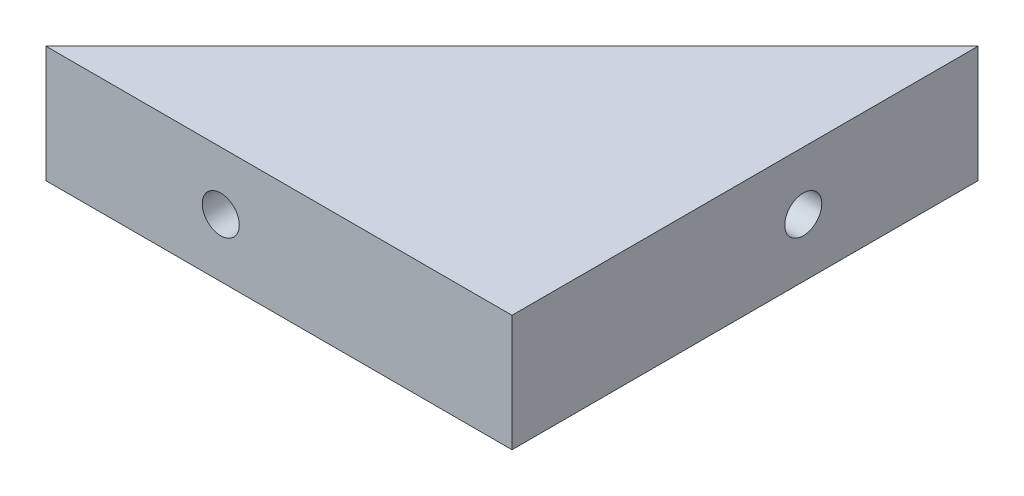
ISO-10303-21;
HEADER;
FILE_DESCRIPTION(('STEP AP214'),'2;1');
FILE_NAME('part.step','',(''),(''),'','','');
FILE_SCHEMA(('AUTOMOTIVE_DESIGN { 1 0 10303 214 1 1 1 1 }'));
ENDSEC;
DATA;
#1=APPLICATION_CONTEXT('core data for automotive mechanical design processes');
#2=APPLICATION_PROTOCOL_DEFINITION('international standard','automotive_design',2000,#1);
#3=PRODUCT_CONTEXT('',#1,'mechanical');
#4=PRODUCT('Part','Part','',(#3));
#5=PRODUCT_RELATED_PRODUCT_CATEGORY('part','',(#4));
#6=PRODUCT_DEFINITION_FORMATION('','',#4);
#7=PRODUCT_DEFINITION_CONTEXT('part definition',#1,'design');
#8=PRODUCT_DEFINITION('design','',#6,#7);
#9=PRODUCT_DEFINITION_SHAPE('','',#8);
#10=(LENGTH_UNIT() NAMED_UNIT(*) SI_UNIT(.MILLI.,.METRE.));
#11=(NAMED_UNIT(*) PLANE_ANGLE_UNIT() SI_UNIT($,.RADIAN.));
#12=(NAMED_UNIT(*) SI_UNIT($,.STERADIAN.) SOLID_ANGLE_UNIT());
#13=UNCERTAINTY_MEASURE_WITH_UNIT(LENGTH_MEASURE(1.E-05),#10,'distance_accuracy_value','');
#14=(GEOMETRIC_REPRESENTATION_CONTEXT(3) GLOBAL_UNCERTAINTY_ASSIGNED_CONTEXT((#13)) GLOBAL_UNIT_ASSIGNED_CONTEXT((#10,
#11,#12)) REPRESENTATION_CONTEXT('',''));
#15=CARTESIAN_POINT('',(0.,0.,0.));
#16=DIRECTION('',(0.,0.,1.));
#17=DIRECTION('',(1.,0.,0.));
#18=AXIS2_PLACEMENT_3D('',#15,#16,#17);
#19=CARTESIAN_POINT('',(25.4,12.7,25.4));
#20=DIRECTION('',(-1.,0.,0.));
#21=DIRECTION('',(0.,0.,1.));
#22=AXIS2_PLACEMENT_3D('',#19,#20,#21);
#23=PLANE('',#22);
#24=CARTESIAN_POINT('',(25.4,6.35,-6.34999999999998));
#25=DIRECTION('',(1.,0.,0.));
#26=DIRECTION('',(0.,0.,-1.));
#27=AXIS2_PLACEMENT_3D('',#24,#25,#26);
#28=CIRCLE('',#27,2.01929999999999);
#29=CARTESIAN_POINT('',(25.4,6.35,-8.36929999999997));
#30=VERTEX_POINT('',#29);
#31=EDGE_CURVE('E89',#30,#30,#28,.T.);
#32=ORIENTED_EDGE('',*,*,#31,.F.);
#33=EDGE_LOOP('',(#32));
#34=FACE_BOUND('',#33,.T.);
#35=DIRECTION('',(0.,0.,-1.));
#36=VECTOR('',#35,1.);
#37=CARTESIAN_POINT('',(25.4,0.,25.4));
#38=LINE('',#37,#36);
#39=CARTESIAN_POINT('',(25.4,0.,25.4));
#40=VERTEX_POINT('',#39);
#41=CARTESIAN_POINT('',(25.4,0.,-25.4));
#42=VERTEX_POINT('',#41);
#43=EDGE_CURVE('E82',#40,#42,#38,.T.);
#44=ORIENTED_EDGE('',*,*,#43,.T.);
#45=DIRECTION('',(0.,-1.,0.));
#46=VECTOR('',#45,1.);
#47=CARTESIAN_POINT('',(25.4,12.7,-25.4));
#48=LINE('',#47,#46);
#49=CARTESIAN_POINT('',(25.4,12.7,-25.4));
#50=VERTEX_POINT('',#49);
#51=EDGE_CURVE('E11',#50,#42,#48,.T.);
#52=ORIENTED_EDGE('',*,*,#51,.F.);
#53=DIRECTION('',(0.,0.,-1.));
#54=VECTOR('',#53,1.);
#55=CARTESIAN_POINT('',(25.4,12.7,25.4));
#56=LINE('',#55,#54);
#57=CARTESIAN_POINT('',(25.4,12.7,25.4));
#58=VERTEX_POINT('',#57);
#59=EDGE_CURVE('E75',#58,#50,#56,.T.);
#60=ORIENTED_EDGE('',*,*,#59,.F.);
#61=DIRECTION('',(0.,-1.,0.));
#62=VECTOR('',#61,1.);
#63=CARTESIAN_POINT('',(25.4,12.7,25.4));
#64=LINE('',#63,#62);
#65=EDGE_CURVE('E83',#58,#40,#64,.T.);
#66=ORIENTED_EDGE('',*,*,#65,.T.);
#67=EDGE_LOOP('',(#44,#52,#60,#66));
#68=FACE_BOUND('',#67,.T.);
#69=ADVANCED_FACE('F34',(#34,#68),#23,.F.);
#70=CARTESIAN_POINT('',(-25.4,12.7,25.4));
#71=DIRECTION('',(0.707106781186548,0.,0.707106781186548));
#72=DIRECTION('',(0.707106781186548,0.,-0.707106781186548));
#73=AXIS2_PLACEMENT_3D('',#70,#71,#72);
#74=PLANE('',#73);
#75=CARTESIAN_POINT('',(-6.35000000000001,6.35,6.35000000000002));
#76=DIRECTION('',(0.707106781186548,0.,0.707106781186548));
#77=DIRECTION('',(-0.707106781186548,0.,0.707106781186548));
#78=AXIS2_PLACEMENT_3D('',#75,#76,#77);
#79=ELLIPSE('',#78,2.85572144649997,2.01929999999999);
#80=CARTESIAN_POINT('',(-8.3693,6.35,8.36930000000001));
#81=VERTEX_POINT('',#80);
#82=EDGE_CURVE('E37',#81,#81,#79,.T.);
#83=ORIENTED_EDGE('',*,*,#82,.T.);
#84=EDGE_LOOP('',(#83));
#85=FACE_BOUND('',#84,.T.);
#86=CARTESIAN_POINT('',(6.34999999999999,6.35,-6.34999999999998));
#87=DIRECTION('',(0.707106781186548,0.,0.707106781186548));
#88=DIRECTION('',(0.707106781186548,0.,-0.707106781186548));
#89=AXIS2_PLACEMENT_3D('',#86,#87,#88);
#90=ELLIPSE('',#89,2.85572144649997,2.01929999999999);
#91=CARTESIAN_POINT('',(8.36929999999998,6.35,-8.36929999999997));
#92=VERTEX_POINT('',#91);
#93=EDGE_CURVE('E85',#92,#92,#90,.T.);
#94=ORIENTED_EDGE('',*,*,#93,.T.);
#95=EDGE_LOOP('',(#94));
#96=FACE_BOUND('',#95,.T.);
#97=DIRECTION('',(-0.707106781186547,0.,0.707106781186547));
#98=VECTOR('',#97,1.);
#99=CARTESIAN_POINT('',(-25.4,0.,25.4));
#100=LINE('',#99,#98);
#101=CARTESIAN_POINT('',(-25.4,0.,25.4));
#102=VERTEX_POINT('',#101);
#103=EDGE_CURVE('E63',#42,#102,#100,.T.);
#104=ORIENTED_EDGE('',*,*,#103,.T.);
#105=DIRECTION('',(0.,-1.,0.));
#106=VECTOR('',#105,1.);
#107=CARTESIAN_POINT('',(-25.4,12.7,25.4));
#108=LINE('',#107,#106);
#109=CARTESIAN_POINT('',(-25.4,12.7,25.4));
#110=VERTEX_POINT('',#109);
#111=EDGE_CURVE('E43',#110,#102,#108,.T.);
#112=ORIENTED_EDGE('',*,*,#111,.F.);
#113=DIRECTION('',(-0.707106781186547,0.,0.707106781186547));
#114=VECTOR('',#113,1.);
#115=CARTESIAN_POINT('',(-25.4,12.7,25.4));
#116=LINE('',#115,#114);
#117=EDGE_CURVE('E71',#50,#110,#116,.T.);
#118=ORIENTED_EDGE('',*,*,#117,.F.);
#119=ORIENTED_EDGE('',*,*,#51,.T.);
#120=EDGE_LOOP('',(#104,#112,#118,#119));
#121=FACE_BOUND('',#120,.T.);
#122=ADVANCED_FACE('F72',(#85,#96,#121),#74,.F.);
#123=CARTESIAN_POINT('',(-25.4,12.7,25.4));
#124=DIRECTION('',(0.,0.,-1.));
#125=DIRECTION('',(-1.,0.,0.));
#126=AXIS2_PLACEMENT_3D('',#123,#124,#125);
#127=PLANE('',#126);
#128=CARTESIAN_POINT('',(-6.35000000000001,6.35,25.4));
#129=DIRECTION('',(0.,0.,1.));
#130=DIRECTION('',(1.,0.,0.));
#131=AXIS2_PLACEMENT_3D('',#128,#129,#130);
#132=CIRCLE('',#131,2.01929999999999);
#133=CARTESIAN_POINT('',(-4.33070000000002,6.35,25.4));
#134=VERTEX_POINT('',#133);
#135=EDGE_CURVE('E119',#134,#134,#132,.T.);
#136=ORIENTED_EDGE('',*,*,#135,.F.);
#137=EDGE_LOOP('',(#136));
#138=FACE_BOUND('',#137,.T.);
#139=DIRECTION('',(1.,0.,0.));
#140=VECTOR('',#139,1.);
#141=CARTESIAN_POINT('',(-25.4,0.,25.4));
#142=LINE('',#141,#140);
#143=EDGE_CURVE('E68',#102,#40,#142,.T.);
#144=ORIENTED_EDGE('',*,*,#143,.T.);
#145=ORIENTED_EDGE('',*,*,#65,.F.);
#146=DIRECTION('',(1.,0.,0.));
#147=VECTOR('',#146,1.);
#148=CARTESIAN_POINT('',(-25.4,12.7,25.4));
#149=LINE('',#148,#147);
#150=EDGE_CURVE('E51',#110,#58,#149,.T.);
#151=ORIENTED_EDGE('',*,*,#150,.F.);
#152=ORIENTED_EDGE('',*,*,#111,.T.);
#153=EDGE_LOOP('',(#144,#145,#151,#152));
#154=FACE_BOUND('',#153,.T.);
#155=ADVANCED_FACE('F95',(#138,#154),#127,.F.);
#156=CARTESIAN_POINT('',(0.,12.7,0.));
#157=DIRECTION('',(0.,-1.,0.));
#158=DIRECTION('',(0.,0.,-1.));
#159=AXIS2_PLACEMENT_3D('',#156,#157,#158);
#160=PLANE('',#159);
#161=ORIENTED_EDGE('',*,*,#59,.T.);
#162=ORIENTED_EDGE('',*,*,#117,.T.);
#163=ORIENTED_EDGE('',*,*,#150,.T.);
#164=EDGE_LOOP('',(#161,#162,#163));
#165=FACE_BOUND('',#164,.T.);
#166=ADVANCED_FACE('F78',(#165),#160,.F.);
#167=CARTESIAN_POINT('',(0.,0.,0.));
#168=DIRECTION('',(0.,-1.,0.));
#169=DIRECTION('',(0.,0.,-1.));
#170=AXIS2_PLACEMENT_3D('',#167,#168,#169);
#171=PLANE('',#170);
#172=ORIENTED_EDGE('',*,*,#43,.F.);
#173=ORIENTED_EDGE('',*,*,#143,.F.);
#174=ORIENTED_EDGE('',*,*,#103,.F.);
#175=EDGE_LOOP('',(#172,#173,#174));
#176=FACE_BOUND('',#175,.T.);
#177=ADVANCED_FACE('F96',(#176),#171,.T.);
#178=CARTESIAN_POINT('',(25.4,6.35,-6.34999999999998));
#179=DIRECTION('',(1.,0.,0.));
#180=DIRECTION('',(0.,0.,-1.));
#181=AXIS2_PLACEMENT_3D('',#178,#179,#180);
#182=CYLINDRICAL_SURFACE('',#181,2.01929999999999);
#183=ORIENTED_EDGE('',*,*,#31,.T.);
#184=EDGE_LOOP('',(#183));
#185=FACE_BOUND('',#184,.T.);
#186=ORIENTED_EDGE('',*,*,#93,.F.);
#187=EDGE_LOOP('',(#186));
#188=FACE_BOUND('',#187,.T.);
#189=ADVANCED_FACE('F98',(#185,#188),#182,.F.);
#190=CARTESIAN_POINT('',(-6.35000000000001,6.35,25.4));
#191=DIRECTION('',(0.,0.,1.));
#192=DIRECTION('',(1.,0.,0.));
#193=AXIS2_PLACEMENT_3D('',#190,#191,#192);
#194=CYLINDRICAL_SURFACE('',#193,2.01929999999999);
#195=ORIENTED_EDGE('',*,*,#135,.T.);
#196=EDGE_LOOP('',(#195));
#197=FACE_BOUND('',#196,.T.);
#198=ORIENTED_EDGE('',*,*,#82,.F.);
#199=EDGE_LOOP('',(#198));
#200=FACE_BOUND('',#199,.T.);
#201=ADVANCED_FACE('F104',(#197,#200),#194,.F.);
#202=CLOSED_SHELL('',(#69,#122,#155,#166,#177,#189,#201));
#203=MANIFOLD_SOLID_BREP('B2',#202);
#204=ADVANCED_BREP_SHAPE_REPRESENTATION('',(#18,#203),#14);
#205=SHAPE_DEFINITION_REPRESENTATION(#9,#204);
ENDSEC;
END-ISO-10303-21;
